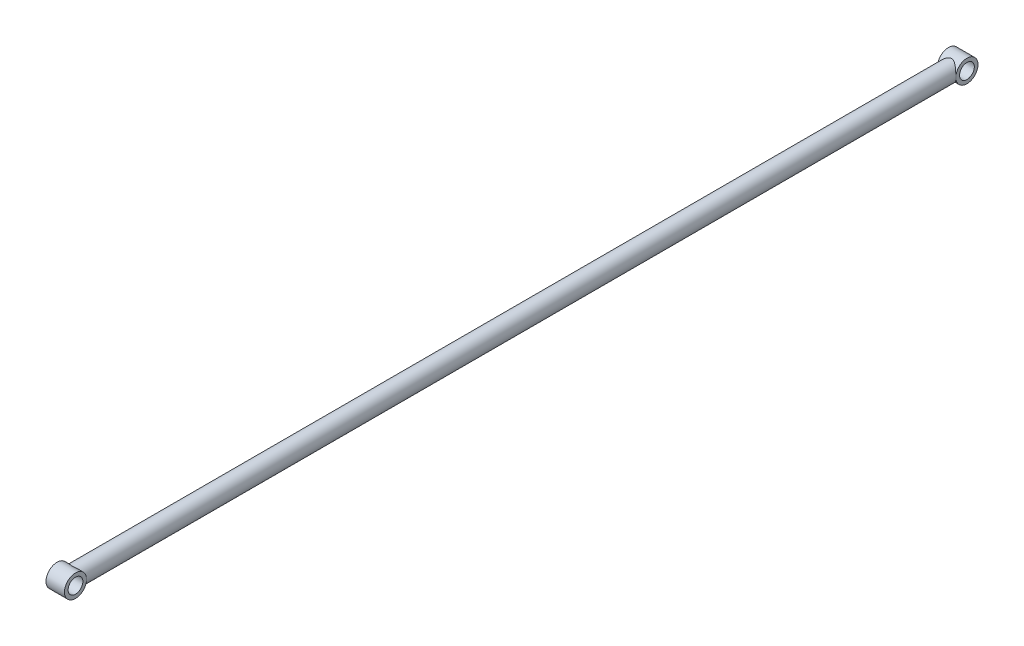
ISO-10303-21;
HEADER;
FILE_DESCRIPTION(('STEP AP214'),'2;1');
FILE_NAME('part.step','',(''),(''),'','','');
FILE_SCHEMA(('AUTOMOTIVE_DESIGN { 1 0 10303 214 1 1 1 1 }'));
ENDSEC;
DATA;
#1=APPLICATION_CONTEXT('core data for automotive mechanical design processes');
#2=APPLICATION_PROTOCOL_DEFINITION('international standard','automotive_design',2000,#1);
#3=PRODUCT_CONTEXT('',#1,'mechanical');
#4=PRODUCT('Part','Part','',(#3));
#5=PRODUCT_RELATED_PRODUCT_CATEGORY('part','',(#4));
#6=PRODUCT_DEFINITION_FORMATION('','',#4);
#7=PRODUCT_DEFINITION_CONTEXT('part definition',#1,'design');
#8=PRODUCT_DEFINITION('design','',#6,#7);
#9=PRODUCT_DEFINITION_SHAPE('','',#8);
#10=(LENGTH_UNIT() NAMED_UNIT(*) SI_UNIT(.MILLI.,.METRE.));
#11=(NAMED_UNIT(*) PLANE_ANGLE_UNIT() SI_UNIT($,.RADIAN.));
#12=(NAMED_UNIT(*) SI_UNIT($,.STERADIAN.) SOLID_ANGLE_UNIT());
#13=UNCERTAINTY_MEASURE_WITH_UNIT(LENGTH_MEASURE(1.E-05),#10,'distance_accuracy_value','');
#14=(GEOMETRIC_REPRESENTATION_CONTEXT(3) GLOBAL_UNCERTAINTY_ASSIGNED_CONTEXT((#13)) GLOBAL_UNIT_ASSIGNED_CONTEXT((#10,
#11,#12)) REPRESENTATION_CONTEXT('',''));
#15=CARTESIAN_POINT('',(0.,0.,0.));
#16=DIRECTION('',(0.,0.,1.));
#17=DIRECTION('',(1.,0.,0.));
#18=AXIS2_PLACEMENT_3D('',#15,#16,#17);
#19=CARTESIAN_POINT('',(0.,0.,483.));
#20=DIRECTION('',(0.,0.,-1.));
#21=DIRECTION('',(-1.,0.,0.));
#22=AXIS2_PLACEMENT_3D('',#19,#20,#21);
#23=CYLINDRICAL_SURFACE('',#22,5.);
#24=CARTESIAN_POINT('',(-5.,0.,477.));
#25=CARTESIAN_POINT('',(-5.0000064862677,-0.118803401095404,476.999993637204));
#26=CARTESIAN_POINT('',(-4.99576243276274,-0.237558182871216,477.003532436608));
#27=CARTESIAN_POINT('',(-4.97888342242901,-0.474087838067089,477.01758781878));
#28=CARTESIAN_POINT('',(-4.96624750352265,-0.591862597565706,477.028105201601));
#29=CARTESIAN_POINT('',(-4.93280067838579,-0.825474733693953,477.055890647865));
#30=CARTESIAN_POINT('',(-4.9119867768663,-0.941311384241484,477.073161184726));
#31=CARTESIAN_POINT('',(-4.86255145148515,-1.17018155731566,477.114066169517));
#32=CARTESIAN_POINT('',(-4.83392655878944,-1.28321381003106,477.137703444833));
#33=CARTESIAN_POINT('',(-4.73740362240781,-1.61550772291658,477.21712549774));
#34=CARTESIAN_POINT('',(-4.65860789353557,-1.82964493287685,477.281630481709));
#35=CARTESIAN_POINT('',(-4.47594785576943,-2.23973970904937,477.429432068903));
#36=CARTESIAN_POINT('',(-4.37207507698347,-2.43569110189251,477.512735020608));
#37=CARTESIAN_POINT('',(-4.17931765246547,-2.7487493551036,477.664796967453));
#38=CARTESIAN_POINT('',(-4.09605321766378,-2.87121824175387,477.729845481327));
#39=CARTESIAN_POINT('',(-3.92057491487889,-3.1065466737462,477.865043917853));
#40=CARTESIAN_POINT('',(-3.82836116355907,-3.21940634431807,477.935193773999));
#41=CARTESIAN_POINT('',(-3.63553308278673,-3.43568816068563,478.079330910766));
#42=CARTESIAN_POINT('',(-3.5348967895774,-3.53908406033979,478.153328021096));
#43=CARTESIAN_POINT('',(-3.32600704379386,-3.73607907111511,478.303506811469));
#44=CARTESIAN_POINT('',(-3.21775455132491,-3.82967941338623,478.379688215443));
#45=CARTESIAN_POINT('',(-2.99186847524307,-4.00872533168451,478.534090593809));
#46=CARTESIAN_POINT('',(-2.87409893732895,-4.09398918746849,478.612323305427));
#47=CARTESIAN_POINT('',(-2.63097870098589,-4.25431125048956,478.767590859531));
#48=CARTESIAN_POINT('',(-2.50562548412927,-4.32936604026977,478.844625293293));
#49=CARTESIAN_POINT('',(-2.24746866950536,-4.46882104937822,478.994988438694));
#50=CARTESIAN_POINT('',(-2.11468364253873,-4.53324636625597,479.068325587028));
#51=CARTESIAN_POINT('',(-1.84110422364282,-4.65107409789268,479.208445967709));
#52=CARTESIAN_POINT('',(-1.70031678782888,-4.70448590476213,479.275234758659));
#53=CARTESIAN_POINT('',(-1.39667622874435,-4.80387055780351,479.404163695034));
#54=CARTESIAN_POINT('',(-1.23299156369284,-4.84867766430581,479.465282103806));
#55=CARTESIAN_POINT('',(-0.896180811817653,-4.92202476595887,479.568128085754));
#56=CARTESIAN_POINT('',(-0.723078773763382,-4.95060424437364,479.609902678024));
#57=CARTESIAN_POINT('',(-0.457661896369253,-4.97982440219376,479.653115686237));
#58=CARTESIAN_POINT('',(-0.367618679010133,-4.98729261982802,479.6642863));
#59=CARTESIAN_POINT('',(-0.186635888055896,-4.99733565959028,479.679348465274));
#60=CARTESIAN_POINT('',(-0.0956963990750102,-4.99991093928053,479.683240697421));
#61=CARTESIAN_POINT('',(0.0861953552895639,-5.00008454722765,479.683502917529));
#62=CARTESIAN_POINT('',(0.177147620700363,-4.99768286475911,479.679872889279));
#63=CARTESIAN_POINT('',(0.358199787378176,-4.98797701095386,479.665309542838));
#64=CARTESIAN_POINT('',(0.448299583463676,-4.98067224244969,479.65437533504));
#65=CARTESIAN_POINT('',(0.634290345987583,-4.96055777117419,479.624616752253));
#66=CARTESIAN_POINT('',(0.730044329719831,-4.94734291419498,479.605214847078));
#67=CARTESIAN_POINT('',(0.919072038911291,-4.91574053984289,479.559612529394));
#68=CARTESIAN_POINT('',(1.01234395824124,-4.89734936269662,479.533407307809));
#69=CARTESIAN_POINT('',(1.28826795172837,-4.83487145070512,479.446256557005));
#70=CARTESIAN_POINT('',(1.46664526370671,-4.78352415648846,479.376845736021));
#71=CARTESIAN_POINT('',(1.77568076874682,-4.67632227850055,479.239951281895));
#72=CARTESIAN_POINT('',(1.90862269999424,-4.62355194613131,479.174992042876));
#73=CARTESIAN_POINT('',(2.16730339944141,-4.5080868127201,479.039561687936));
#74=CARTESIAN_POINT('',(2.2930378843367,-4.44538619181524,478.969087352102));
#75=CARTESIAN_POINT('',(2.53766285158925,-4.31043075762207,478.825081209764));
#76=CARTESIAN_POINT('',(2.65654383781034,-4.23816312441509,478.751545393107));
#77=CARTESIAN_POINT('',(2.88743564285212,-4.08435401417132,478.603472913388));
#78=CARTESIAN_POINT('',(2.99944783455598,-4.00281439970947,478.528936453981));
#79=CARTESIAN_POINT('',(3.22226109628938,-3.82600354374298,478.376579223159));
#80=CARTESIAN_POINT('',(3.33269201981398,-3.73023700414116,478.298790707347));
#81=CARTESIAN_POINT('',(3.54559939981495,-3.52848927170191,478.145535959127));
#82=CARTESIAN_POINT('',(3.64807467199073,-3.42250656330075,478.070070073477));
#83=CARTESIAN_POINT('',(3.84425294796657,-3.20056123189962,477.923183546337));
#84=CARTESIAN_POINT('',(3.93797365950219,-3.08461970676706,477.851754859816));
#85=CARTESIAN_POINT('',(4.11599426421243,-2.84274064052483,477.714338905395));
#86=CARTESIAN_POINT('',(4.20029381312791,-2.71680273442434,477.648351836361));
#87=CARTESIAN_POINT('',(4.39878554184224,-2.3882746321479,477.491466854075));
#88=CARTESIAN_POINT('',(4.50631929530232,-2.17932731194439,477.40501053214));
#89=CARTESIAN_POINT('',(4.64613821914317,-1.85137170360796,477.291596129459));
#90=CARTESIAN_POINT('',(4.689173122187,-1.73959798407532,477.256495593987));
#91=CARTESIAN_POINT('',(4.76751793421721,-1.51170856686371,477.192357028335));
#92=CARTESIAN_POINT('',(4.8028317106046,-1.39559507719854,477.163315963388));
#93=CARTESIAN_POINT('',(4.8654345331928,-1.15874024023418,477.111694818951));
#94=CARTESIAN_POINT('',(4.89265476556206,-1.0379685511683,477.089170185509));
#95=CARTESIAN_POINT('',(4.93816722227974,-0.793680719841815,477.0514427748));
#96=CARTESIAN_POINT('',(4.95646386645161,-0.670165967971585,477.036236372888));
#97=CARTESIAN_POINT('',(4.98377697031547,-0.421443909131152,477.013517273965));
#98=CARTESIAN_POINT('',(4.99279601788869,-0.296237084023795,477.006002431483));
#99=CARTESIAN_POINT('',(5.00137053830483,-0.0452813606586437,476.998858338269));
#100=CARTESIAN_POINT('',(5.00092704086014,0.0804674771284984,476.999228229523));
#101=CARTESIAN_POINT('',(4.99121319090849,0.316217699578095,477.007320807918));
#102=CARTESIAN_POINT('',(4.9830095886813,0.426296149457927,477.014154882391));
#103=CARTESIAN_POINT('',(4.95942180024421,0.64517857144736,477.033776596911));
#104=CARTESIAN_POINT('',(4.94403538382094,0.753982136950752,477.046566086069));
#105=CARTESIAN_POINT('',(4.90632392627912,0.969508932578446,477.077846411027));
#106=CARTESIAN_POINT('',(4.88400108118505,1.07623280976907,477.096335442378));
#107=CARTESIAN_POINT('',(4.8327411453964,1.28701083316523,477.138670741227));
#108=CARTESIAN_POINT('',(4.80380153552002,1.39106394571253,477.162519049088));
#109=CARTESIAN_POINT('',(4.70677908129294,1.70100357204874,477.242190020335));
#110=CARTESIAN_POINT('',(4.62897463511249,1.90197317990282,477.305734510938));
#111=CARTESIAN_POINT('',(4.45119251532416,2.28736622034071,477.449291701797));
#112=CARTESIAN_POINT('',(4.35120664535604,2.47178350112449,477.529310488757));
#113=CARTESIAN_POINT('',(4.16241303362752,2.77431022087595,477.678035970102));
#114=CARTESIAN_POINT('',(4.07807881363132,2.89671891082132,477.74381246034));
#115=CARTESIAN_POINT('',(3.90043631108387,3.1318212445681,477.880412696568));
#116=CARTESIAN_POINT('',(3.80712768883622,3.24451452031815,477.951236633586));
#117=CARTESIAN_POINT('',(3.61204642318564,3.46039828484852,478.096670900892));
#118=CARTESIAN_POINT('',(3.51024916115602,3.56355916557869,478.171291981155));
#119=CARTESIAN_POINT('',(3.29899388009138,3.75997885952884,478.322615719837));
#120=CARTESIAN_POINT('',(3.18953694443014,3.85323906840856,478.399318082945));
#121=CARTESIAN_POINT('',(2.96121350414865,4.03144708201697,478.554592788302));
#122=CARTESIAN_POINT('',(2.84221365304639,4.11621624228707,478.633174029159));
#123=CARTESIAN_POINT('',(2.59654816531034,4.27543853436333,478.788939860809));
#124=CARTESIAN_POINT('',(2.46987979366061,4.34988795406836,478.866123940397));
#125=CARTESIAN_POINT('',(2.20902653418008,4.48797579821684,479.016477189005));
#126=CARTESIAN_POINT('',(2.0748627531341,4.55164272839419,479.089656586787));
#127=CARTESIAN_POINT('',(1.79841659242417,4.66777738062605,479.22904841427));
#128=CARTESIAN_POINT('',(1.65614180525592,4.72025536508454,479.295267199669));
#129=CARTESIAN_POINT('',(1.35146946258264,4.81674752553359,479.421491086304));
#130=CARTESIAN_POINT('',(1.18836978046208,4.85976816309613,479.480594639897));
#131=CARTESIAN_POINT('',(0.853057506761427,4.9296432417836,479.579129868936));
#132=CARTESIAN_POINT('',(0.680868858019852,4.95653805629941,479.618610630155));
#133=CARTESIAN_POINT('',(0.417267118823255,4.98335884043905,479.658388143927));
#134=CARTESIAN_POINT('',(0.327939885729207,4.99004397434121,479.668407002933));
#135=CARTESIAN_POINT('',(0.148522532583795,4.9985987546237,479.681253423056));
#136=CARTESIAN_POINT('',(0.0584324772191264,5.00046880529626,479.68408158793));
#137=CARTESIAN_POINT('',(-0.121644228189545,4.99933140644563,479.682367649082));
#138=CARTESIAN_POINT('',(-0.211630875727444,4.9963238411074,479.677825370354));
#139=CARTESIAN_POINT('',(-0.390705731691063,4.98551920595952,479.661633404506));
#140=CARTESIAN_POINT('',(-0.479793444537757,4.9777196268474,479.649979993715));
#141=CARTESIAN_POINT('',(-0.665670000297338,4.95646386284236,479.618601030407));
#142=CARTESIAN_POINT('',(-0.762277582328066,4.94249693749089,479.598152480986));
#143=CARTESIAN_POINT('',(-0.952897655384701,4.90931375512972,479.550437000639));
#144=CARTESIAN_POINT('',(-1.04690820177175,4.89009367595841,479.523165106317));
#145=CARTESIAN_POINT('',(-1.32490519247817,4.82502893529804,479.432849622302));
#146=CARTESIAN_POINT('',(-1.50447425917324,4.77182601328654,479.361379650537));
#147=CARTESIAN_POINT('',(-1.81560530153243,4.66101333620408,479.220942915864));
#148=CARTESIAN_POINT('',(-1.94948557461575,4.60651894445027,479.154442116725));
#149=CARTESIAN_POINT('',(-2.20989471783698,4.48741065580192,479.016097847012));
#150=CARTESIAN_POINT('',(-2.33641925480263,4.42279087534705,478.944251283));
#151=CARTESIAN_POINT('',(-2.5824750393766,4.28378589016378,478.797690769041));
#152=CARTESIAN_POINT('',(-2.70199665984685,4.20938767793853,478.722973095249));
#153=CARTESIAN_POINT('',(-2.93399936330076,4.05109347216135,478.572749153453));
#154=CARTESIAN_POINT('',(-3.04648185894299,3.96719939385672,478.497243047248));
#155=CARTESIAN_POINT('',(-3.26970299172266,3.78559728592243,478.343380537841));
#156=CARTESIAN_POINT('',(-3.3800842070449,3.68741297206322,478.265066438866));
#157=CARTESIAN_POINT('',(-3.59266286414712,3.48062708656653,478.111046523001));
#158=CARTESIAN_POINT('',(-3.69485901563621,3.3720238784052,478.035341118412));
#159=CARTESIAN_POINT('',(-3.89018127821474,3.14465963115777,477.888308540529));
#160=CARTESIAN_POINT('',(-3.98332637820879,3.02592088507445,477.816972322432));
#161=CARTESIAN_POINT('',(-4.15984718243097,2.77827797167377,477.680110195278));
#162=CARTESIAN_POINT('',(-4.24322187964889,2.64937275881158,477.614584885306));
#163=CARTESIAN_POINT('',(-4.43658392581503,2.31715775505719,477.461199242977));
#164=CARTESIAN_POINT('',(-4.54010823809425,2.1078590133518,477.377736073905));
#165=CARTESIAN_POINT('',(-4.67390583373148,1.78004652854666,477.268967142579));
#166=CARTESIAN_POINT('',(-4.71491832045568,1.66848545194781,477.235452843433));
#167=CARTESIAN_POINT('',(-4.78927419077684,1.44122911865454,477.174479197701));
#168=CARTESIAN_POINT('',(-4.82261863938538,1.3255344386571,477.147019010283));
#169=CARTESIAN_POINT('',(-4.90034346391489,1.01333234603933,477.082855108749));
#170=CARTESIAN_POINT('',(-4.937546782437,0.813745597053018,477.05195986098));
#171=CARTESIAN_POINT('',(-4.98736819813601,0.409390797411289,477.010538835449));
#172=CARTESIAN_POINT('',(-4.99998882825426,0.204623282772224,477.000010959083));
#173=CARTESIAN_POINT('',(-5.,0.,477.));
#174=B_SPLINE_CURVE_WITH_KNOTS('',3,(#24,#25,#26,#27,#28,#29,#30,#31,#32,#33,#34,#35,#36,#37,
#38,#39,#40,#41,#42,#43,#44,#45,#46,#47,#48,#49,#50,#51,#52,#53,#54,#55,#56,#57,#58,#59,#60,#61,
#62,#63,#64,#65,#66,#67,#68,#69,#70,#71,#72,#73,#74,#75,#76,#77,#78,#79,#80,#81,#82,#83,#84,#85,
#86,#87,#88,#89,#90,#91,#92,#93,#94,#95,#96,#97,#98,#99,#100,#101,#102,#103,#104,#105,#106,#107,
#108,#109,#110,#111,#112,#113,#114,#115,#116,#117,#118,#119,#120,#121,#122,#123,#124,#125,#126,
#127,#128,#129,#130,#131,#132,#133,#134,#135,#136,#137,#138,#139,#140,#141,#142,#143,#144,#145,
#146,#147,#148,#149,#150,#151,#152,#153,#154,#155,#156,#157,#158,#159,#160,#161,#162,#163,#164,
#165,#166,#167,#168,#169,#170,#171,#172,#173),.UNSPECIFIED.,.T.,.F.,(4,2,2,2,2,2,2,2,2,2,2,2,2,
2,2,2,2,2,2,2,2,2,2,2,2,2,2,2,2,2,2,2,2,2,2,2,2,2,2,2,2,2,2,2,2,2,2,2,2,2,2,2,2,2,2,2,2,2,2,2,2,
2,2,2,2,2,2,2,2,2,2,2,2,2,4),(0.,0.356198531128416,0.712437905356867,1.06880787854775,
1.42533637270189,2.13333209783901,2.84156728725028,3.32622201622347,3.81087042808179,
4.29682459639562,4.78271761425378,5.27755036039969,5.77254834493278,6.26636031071484,
6.75974940543418,7.29936255278486,7.83765708456697,8.11040822806109,8.383133864024,
8.6558600877151,8.92861953390798,9.22392701856227,9.51944381892732,10.1116379066242,
10.582376912049,11.0533928323055,11.5250464324408,11.996605452641,12.4928422896339,
12.9891528567515,13.4844367603641,13.9797387562553,14.7274446962694,15.1015034988402,
15.4753745093338,15.8523389140403,16.2291164194434,16.6057887984767,16.9824201883013,
17.3138076935886,17.6452981608745,17.9766837873555,18.3081957920454,18.9794342536001,
19.6509211619366,20.1379627282137,20.6250227371038,21.1135480143904,21.6020043344425,
22.0992028034936,22.5965796576368,23.0926203414624,23.5882040850609,24.1228614856739,
24.6561746412002,24.9262177314023,25.1962381470461,25.4662649741993,25.7364333195519,
26.0351569724181,26.3340985560116,26.9331443359534,27.4099325615986,27.886998869087,
28.3647063284085,28.8423176087135,29.3434029116177,29.8445670506113,30.3446559675375,
30.8447963820895,31.5852621624672,31.9553671316837,32.3254206660413,32.9389891607905,
33.5524944315665),.UNSPECIFIED.);
#175=CARTESIAN_POINT('',(-5.,0.,477.));
#176=VERTEX_POINT('',#175);
#177=CARTESIAN_POINT('',(5.00000000000002,0.,477.));
#178=VERTEX_POINT('',#177);
#179=EDGE_CURVE('E75',#176,#178,#174,.T.);
#180=ORIENTED_EDGE('',*,*,#179,.F.);
#181=EDGE_CURVE('E61',#178,#176,#174,.T.);
#182=ORIENTED_EDGE('',*,*,#181,.F.);
#183=EDGE_LOOP('',(#180,#182));
#184=FACE_BOUND('',#183,.T.);
#185=CARTESIAN_POINT('',(5.,0.,6.));
#186=CARTESIAN_POINT('',(5.00002798627288,-0.119348935079419,6.00002919850301));
#187=CARTESIAN_POINT('',(4.99572803553543,-0.23867958036178,5.99644020652463));
#188=CARTESIAN_POINT('',(4.97868412788821,-0.476234476230305,5.98224494804962));
#189=CARTESIAN_POINT('',(4.96594611312676,-0.594459446069387,5.97164361970086));
#190=CARTESIAN_POINT('',(4.93236700382239,-0.828002477996366,5.94374988935124));
#191=CARTESIAN_POINT('',(4.91158897146557,-0.943335902346165,5.9265095655111));
#192=CARTESIAN_POINT('',(4.86229105276058,-1.17120170011539,5.8857184515863));
#193=CARTESIAN_POINT('',(4.83377018032473,-1.28373371476774,5.86216685773619));
#194=CARTESIAN_POINT('',(4.76951835736753,-1.50496658686726,5.80930051949784));
#195=CARTESIAN_POINT('',(4.73380779812543,-1.61367728038003,5.78000208014341));
#196=CARTESIAN_POINT('',(4.65562143123109,-1.82705211318845,5.71614428529929));
#197=CARTESIAN_POINT('',(4.61314316805229,-1.93171476653797,5.68158302050031));
#198=CARTESIAN_POINT('',(4.47616272504167,-2.23926573906388,5.57073812162035));
#199=CARTESIAN_POINT('',(4.3721770693891,-2.43550744867541,5.48734511252619));
#200=CARTESIAN_POINT('',(4.17930372356553,-2.7487842906501,5.33519226752433));
#201=CARTESIAN_POINT('',(4.09603750264319,-2.87124496412886,5.2701422858056));
#202=CARTESIAN_POINT('',(3.92054441805434,-3.10658192431559,5.13493271106889));
#203=CARTESIAN_POINT('',(3.82831737859482,-3.2194580229123,5.06477301781555));
#204=CARTESIAN_POINT('',(3.63548337755196,-3.43574133365567,4.92063241630692));
#205=CARTESIAN_POINT('',(3.53485619448337,-3.53912436048791,4.84664246009394));
#206=CARTESIAN_POINT('',(3.32598578779926,-3.7360970997034,4.69647824059821));
#207=CARTESIAN_POINT('',(3.21774353082589,-3.82968805133515,4.62030425527637));
#208=CARTESIAN_POINT('',(2.99186761360954,-4.00872611376803,4.46590881347895));
#209=CARTESIAN_POINT('',(2.87409722305524,-4.0939904560112,4.3876755543847));
#210=CARTESIAN_POINT('',(2.6309750881559,-4.25431349476038,4.23240687859203));
#211=CARTESIAN_POINT('',(2.50562082230674,-4.32936876969041,4.15537187111191));
#212=CARTESIAN_POINT('',(2.24746373773334,-4.46882350281307,4.00500880900492));
#213=CARTESIAN_POINT('',(2.114679606144,-4.53324821588881,3.93167226471335));
#214=CARTESIAN_POINT('',(1.84110210714595,-4.65107489837774,3.7915530290794));
#215=CARTESIAN_POINT('',(1.70031569672374,-4.70448626106774,3.72476477842125));
#216=CARTESIAN_POINT('',(1.39667699983213,-4.80387030632006,3.59583663196801));
#217=CARTESIAN_POINT('',(1.23299315747397,-4.84867722860129,3.53471849082027));
#218=CARTESIAN_POINT('',(0.896182495864177,-4.92202448714337,3.43187232185616));
#219=CARTESIAN_POINT('',(0.723079629981996,-4.95060414994846,3.39009746162937));
#220=CARTESIAN_POINT('',(0.457661938224444,-4.97982439766832,3.34688432045088));
#221=CARTESIAN_POINT('',(0.367618763795172,-4.98729261281735,3.33571371048368));
#222=CARTESIAN_POINT('',(0.186636059098122,-4.99733565239978,3.32065154554476));
#223=CARTESIAN_POINT('',(0.095696613445123,-4.99991093439811,3.316759309933));
#224=CARTESIAN_POINT('',(-0.0861951407917185,-5.00008455170297,3.31649707573075));
#225=CARTESIAN_POINT('',(-0.177147449414514,-4.99768287160056,3.32012710042958));
#226=CARTESIAN_POINT('',(-0.358199702166334,-4.98797701786367,3.33469044681948));
#227=CARTESIAN_POINT('',(-0.448299541111552,-4.98067224704856,3.34562465813616));
#228=CARTESIAN_POINT('',(-0.634291003932044,-4.9605576999989,3.3753833530699));
#229=CARTESIAN_POINT('',(-0.730045633205449,-4.94734273423708,3.39478541722633));
#230=CARTESIAN_POINT('',(-0.919074596107933,-4.91574007429052,3.44038813776632));
#231=CARTESIAN_POINT('',(-1.0123471235597,-4.89734872024239,3.46659360333995));
#232=CARTESIAN_POINT('',(-1.28827037830915,-4.83487075242421,3.55374438737304));
#233=CARTESIAN_POINT('',(-1.46664643390008,-4.783523750858,3.62315478197574));
#234=CARTESIAN_POINT('',(-1.77567908944062,-4.67632286079959,3.76004797450957));
#235=CARTESIAN_POINT('',(-1.90861943875745,-4.62355324007214,3.82500636461011));
#236=CARTESIAN_POINT('',(-2.1672971701239,-4.50808975490199,3.96043493597843));
#237=CARTESIAN_POINT('',(-2.29303026764359,-4.44539006893123,4.03090833809998));
#238=CARTESIAN_POINT('',(-2.53765563195538,-4.31043506598059,4.1749143659975));
#239=CARTESIAN_POINT('',(-2.6565382300731,-4.23816669614868,4.24845107486114));
#240=CARTESIAN_POINT('',(-2.88743300391471,-4.08435593589021,4.39652533009788));
#241=CARTESIAN_POINT('',(-2.99944655755873,-4.00281541487259,4.47106267206462));
#242=CARTESIAN_POINT('',(-3.22225027568276,-3.82601212839693,4.62341337862811));
#243=CARTESIAN_POINT('',(-3.33267109721392,-3.73025514063295,4.70119455751783));
#244=CARTESIAN_POINT('',(-3.54556008678871,-3.52852821337353,4.85443541775559));
#245=CARTESIAN_POINT('',(-3.64802705005762,-3.42255673211236,4.92989474637107));
#246=CARTESIAN_POINT('',(-3.84421060857415,-3.2006128271596,5.07678427846323));
#247=CARTESIAN_POINT('',(-3.93794315555609,-3.08465940978153,5.14822172873355));
#248=CARTESIAN_POINT('',(-4.11598177032474,-2.84275936137359,5.28565131588156));
#249=CARTESIAN_POINT('',(-4.20028786473935,-2.71681275857424,5.35164346814102));
#250=CARTESIAN_POINT('',(-4.39889001810325,-2.38810144095985,5.50861571334714));
#251=CARTESIAN_POINT('',(-4.50650789937269,-2.17895977321482,5.59514105315609));
#252=CARTESIAN_POINT('',(-4.64632915436093,-1.85088623475908,5.70855943809661));
#253=CARTESIAN_POINT('',(-4.68931579975437,-1.73920687354843,5.74362100254321));
#254=CARTESIAN_POINT('',(-4.76757931871188,-1.51150608578613,5.80769343721714));
#255=CARTESIAN_POINT('',(-4.8028598770863,-1.39548676568957,5.83670719901046));
#256=CARTESIAN_POINT('',(-4.86104289099879,-1.17535732699399,5.88468396792441));
#257=CARTESIAN_POINT('',(-4.88496398649261,-1.07169341842585,5.90446771651074));
#258=CARTESIAN_POINT('',(-4.92625539477401,-0.862207885533472,5.93867484563281));
#259=CARTESIAN_POINT('',(-4.94362692805165,-0.756386667094952,5.95309922486268));
#260=CARTESIAN_POINT('',(-4.97164997323593,-0.542568390622355,5.97639011806746));
#261=CARTESIAN_POINT('',(-4.98225886411516,-0.434561874332823,5.9852213796444));
#262=CARTESIAN_POINT('',(-4.99644567156344,-0.217707897793812,5.99703818296618));
#263=CARTESIAN_POINT('',(-5.00001943921961,-0.108859979293944,6.00002027520211));
#264=CARTESIAN_POINT('',(-5.,0.,6.));
#265=B_SPLINE_CURVE_WITH_KNOTS('',3,(#185,#186,#187,#188,#189,#190,#191,#192,#193,#194,#195,
#196,#197,#198,#199,#200,#201,#202,#203,#204,#205,#206,#207,#208,#209,#210,#211,#212,#213,#214,
#215,#216,#217,#218,#219,#220,#221,#222,#223,#224,#225,#226,#227,#228,#229,#230,#231,#232,#233,
#234,#235,#236,#237,#238,#239,#240,#241,#242,#243,#244,#245,#246,#247,#248,#249,#250,#251,#252,
#253,#254,#255,#256,#257,#258,#259,#260,#261,#262,#263,#264),.UNSPECIFIED.,.F.,.F.,(4,2,2,2,2,2,
2,2,2,2,2,2,2,2,2,2,2,2,2,2,2,2,2,2,2,2,2,2,2,2,2,2,2,2,2,2,2,2,2,4),(0.,0.357886576578299,
0.715521394269878,1.07040616284639,1.42533614891328,1.77927332038449,2.13333920459453,
2.84213783886469,3.32683244474596,3.81153656126864,4.29744314238673,4.78328815440653,
5.27812448023868,5.77312624430843,6.26693455915681,6.76031994717008,7.29993047702809,
7.83822762424364,8.1109786393578,8.38370414677767,8.65643049857137,8.92919007358413,
9.2244995672027,9.52001838035353,10.112208453625,10.5829416913736,11.0539519263477,
11.52561142687,11.997176001593,12.4933658472267,12.9896307049052,13.4849706986806,
13.9803092931816,14.7286685065876,15.1023956024283,15.4759436005044,15.8002491052014,
16.124494146696,16.4507630235861,16.7772242576031),.UNSPECIFIED.);
#266=CARTESIAN_POINT('',(5.,0.,6.));
#267=VERTEX_POINT('',#266);
#268=CARTESIAN_POINT('',(-5.,0.,6.));
#269=VERTEX_POINT('',#268);
#270=EDGE_CURVE('E11',#267,#269,#265,.T.);
#271=ORIENTED_EDGE('',*,*,#270,.F.);
#272=CARTESIAN_POINT('',(-5.,0.,6.));
#273=CARTESIAN_POINT('',(-5.00002798627288,0.119348935079419,6.00002919850301));
#274=CARTESIAN_POINT('',(-4.99572803553543,0.23867958036178,5.99644020652463));
#275=CARTESIAN_POINT('',(-4.97868412788821,0.476234476230305,5.98224494804962));
#276=CARTESIAN_POINT('',(-4.96594611312676,0.594459446069387,5.97164361970086));
#277=CARTESIAN_POINT('',(-4.93236700382239,0.828002477996366,5.94374988935124));
#278=CARTESIAN_POINT('',(-4.91158897146557,0.943335902346166,5.9265095655111));
#279=CARTESIAN_POINT('',(-4.86229105276058,1.17120170011539,5.8857184515863));
#280=CARTESIAN_POINT('',(-4.83377018032473,1.28373371476774,5.86216685773619));
#281=CARTESIAN_POINT('',(-4.76951835736753,1.50496658686726,5.80930051949784));
#282=CARTESIAN_POINT('',(-4.73380779812543,1.61367728038003,5.78000208014341));
#283=CARTESIAN_POINT('',(-4.65562143123109,1.82705211318845,5.71614428529929));
#284=CARTESIAN_POINT('',(-4.61314316805229,1.93171476653797,5.68158302050031));
#285=CARTESIAN_POINT('',(-4.47616272504167,2.23926573906388,5.57073812162035));
#286=CARTESIAN_POINT('',(-4.3721770693891,2.43550744867541,5.48734511252619));
#287=CARTESIAN_POINT('',(-4.17930372356553,2.7487842906501,5.33519226752433));
#288=CARTESIAN_POINT('',(-4.09603750264319,2.87124496412886,5.2701422858056));
#289=CARTESIAN_POINT('',(-3.92054441805434,3.10658192431559,5.13493271106889));
#290=CARTESIAN_POINT('',(-3.82831737859482,3.2194580229123,5.06477301781555));
#291=CARTESIAN_POINT('',(-3.63548337755196,3.43574133365567,4.92063241630691));
#292=CARTESIAN_POINT('',(-3.53485619448337,3.53912436048791,4.84664246009394));
#293=CARTESIAN_POINT('',(-3.32598578779926,3.7360970997034,4.69647824059821));
#294=CARTESIAN_POINT('',(-3.21774353082589,3.82968805133515,4.62030425527637));
#295=CARTESIAN_POINT('',(-2.99186761360954,4.00872611376803,4.46590881347895));
#296=CARTESIAN_POINT('',(-2.87409722305524,4.0939904560112,4.3876755543847));
#297=CARTESIAN_POINT('',(-2.6309750881559,4.25431349476038,4.23240687859203));
#298=CARTESIAN_POINT('',(-2.50562082230674,4.32936876969041,4.15537187111191));
#299=CARTESIAN_POINT('',(-2.24746373773334,4.46882350281307,4.00500880900492));
#300=CARTESIAN_POINT('',(-2.114679606144,4.53324821588881,3.93167226471335));
#301=CARTESIAN_POINT('',(-1.84110210714595,4.65107489837774,3.7915530290794));
#302=CARTESIAN_POINT('',(-1.70031569672374,4.70448626106774,3.72476477842125));
#303=CARTESIAN_POINT('',(-1.39667699983213,4.80387030632006,3.59583663196801));
#304=CARTESIAN_POINT('',(-1.23299315747397,4.84867722860129,3.53471849082027));
#305=CARTESIAN_POINT('',(-0.896182495864177,4.92202448714337,3.43187232185616));
#306=CARTESIAN_POINT('',(-0.723079629981996,4.95060414994845,3.39009746162936));
#307=CARTESIAN_POINT('',(-0.457661938224445,4.97982439766832,3.34688432045088));
#308=CARTESIAN_POINT('',(-0.367618763795173,4.98729261281735,3.33571371048368));
#309=CARTESIAN_POINT('',(-0.186636059098122,4.99733565239978,3.32065154554476));
#310=CARTESIAN_POINT('',(-0.0956966134451239,4.99991093439811,3.316759309933));
#311=CARTESIAN_POINT('',(0.0861951407917178,5.00008455170297,3.31649707573075));
#312=CARTESIAN_POINT('',(0.177147449414514,4.99768287160056,3.32012710042958));
#313=CARTESIAN_POINT('',(0.358199702166334,4.98797701786367,3.33469044681948));
#314=CARTESIAN_POINT('',(0.448299541111552,4.98067224704856,3.34562465813616));
#315=CARTESIAN_POINT('',(0.634291003932044,4.9605576999989,3.3753833530699));
#316=CARTESIAN_POINT('',(0.730045633205449,4.94734273423708,3.39478541722633));
#317=CARTESIAN_POINT('',(0.919074596107933,4.91574007429052,3.44038813776632));
#318=CARTESIAN_POINT('',(1.0123471235597,4.89734872024239,3.46659360333995));
#319=CARTESIAN_POINT('',(1.28827037830915,4.83487075242421,3.55374438737304));
#320=CARTESIAN_POINT('',(1.46664643390008,4.783523750858,3.62315478197574));
#321=CARTESIAN_POINT('',(1.77567908944062,4.67632286079959,3.76004797450956));
#322=CARTESIAN_POINT('',(1.90861943875745,4.62355324007214,3.82500636461011));
#323=CARTESIAN_POINT('',(2.1672971701239,4.50808975490199,3.96043493597843));
#324=CARTESIAN_POINT('',(2.29303026764359,4.44539006893123,4.03090833809998));
#325=CARTESIAN_POINT('',(2.53765563195538,4.31043506598059,4.1749143659975));
#326=CARTESIAN_POINT('',(2.6565382300731,4.23816669614868,4.24845107486114));
#327=CARTESIAN_POINT('',(2.88743300391471,4.08435593589021,4.39652533009788));
#328=CARTESIAN_POINT('',(2.99944655755873,4.00281541487259,4.47106267206462));
#329=CARTESIAN_POINT('',(3.22225027568276,3.82601212839693,4.62341337862811));
#330=CARTESIAN_POINT('',(3.33267109721392,3.73025514063295,4.70119455751783));
#331=CARTESIAN_POINT('',(3.54556008678871,3.52852821337353,4.85443541775559));
#332=CARTESIAN_POINT('',(3.64802705005762,3.42255673211236,4.92989474637106));
#333=CARTESIAN_POINT('',(3.84421060857415,3.2006128271596,5.07678427846323));
#334=CARTESIAN_POINT('',(3.93794315555608,3.08465940978153,5.14822172873355));
#335=CARTESIAN_POINT('',(4.11598177032474,2.84275936137359,5.28565131588156));
#336=CARTESIAN_POINT('',(4.20028786473935,2.71681275857424,5.35164346814102));
#337=CARTESIAN_POINT('',(4.39889001810325,2.38810144095985,5.50861571334714));
#338=CARTESIAN_POINT('',(4.50650789937269,2.17895977321482,5.59514105315609));
#339=CARTESIAN_POINT('',(4.64632915436093,1.85088623475909,5.7085594380966));
#340=CARTESIAN_POINT('',(4.68931579975437,1.73920687354843,5.74362100254321));
#341=CARTESIAN_POINT('',(4.76757931871188,1.51150608578613,5.80769343721714));
#342=CARTESIAN_POINT('',(4.8028598770863,1.39548676568957,5.83670719901046));
#343=CARTESIAN_POINT('',(4.86104289099879,1.17535732699399,5.88468396792441));
#344=CARTESIAN_POINT('',(4.88496398649261,1.07169341842586,5.90446771651074));
#345=CARTESIAN_POINT('',(4.92625539477401,0.862207885533474,5.93867484563281));
#346=CARTESIAN_POINT('',(4.94362692805165,0.756386667094954,5.95309922486268));
#347=CARTESIAN_POINT('',(4.97164997323593,0.542568390622357,5.97639011806746));
#348=CARTESIAN_POINT('',(4.98225886411516,0.434561874332825,5.9852213796444));
#349=CARTESIAN_POINT('',(4.99644567156344,0.217707897793812,5.99703818296618));
#350=CARTESIAN_POINT('',(5.00001943921961,0.108859979293944,6.0000202752021));
#351=CARTESIAN_POINT('',(5.,0.,6.));
#352=B_SPLINE_CURVE_WITH_KNOTS('',3,(#272,#273,#274,#275,#276,#277,#278,#279,#280,#281,#282,
#283,#284,#285,#286,#287,#288,#289,#290,#291,#292,#293,#294,#295,#296,#297,#298,#299,#300,#301,
#302,#303,#304,#305,#306,#307,#308,#309,#310,#311,#312,#313,#314,#315,#316,#317,#318,#319,#320,
#321,#322,#323,#324,#325,#326,#327,#328,#329,#330,#331,#332,#333,#334,#335,#336,#337,#338,#339,
#340,#341,#342,#343,#344,#345,#346,#347,#348,#349,#350,#351),.UNSPECIFIED.,.F.,.F.,(4,2,2,2,2,2,
2,2,2,2,2,2,2,2,2,2,2,2,2,2,2,2,2,2,2,2,2,2,2,2,2,2,2,2,2,2,2,2,2,4),(0.,0.357886576578299,
0.715521394269878,1.07040616284639,1.42533614891328,1.77927332038448,2.13333920459453,
2.84213783886469,3.32683244474596,3.81153656126864,4.29744314238673,4.78328815440653,
5.27812448023868,5.77312624430843,6.26693455915681,6.76031994717008,7.29993047702809,
7.83822762424363,8.11097863935779,8.38370414677767,8.65643049857137,8.92919007358413,
9.2244995672027,9.52001838035353,10.112208453625,10.5829416913736,11.0539519263477,
11.52561142687,11.997176001593,12.4933658472267,12.9896307049052,13.4849706986806,
13.9803092931816,14.7286685065876,15.1023956024283,15.4759436005045,15.8002491052014,
16.124494146696,16.4507630235861,16.7772242576031),.UNSPECIFIED.);
#353=EDGE_CURVE('E49',#269,#267,#352,.T.);
#354=ORIENTED_EDGE('',*,*,#353,.F.);
#355=EDGE_LOOP('',(#271,#354));
#356=FACE_BOUND('',#355,.T.);
#357=ADVANCED_FACE('F39',(#184,#356),#23,.T.);
#358=CARTESIAN_POINT('',(5.,0.,483.));
#359=DIRECTION('',(-1.,0.,0.));
#360=DIRECTION('',(0.,0.,1.));
#361=AXIS2_PLACEMENT_3D('',#358,#359,#360);
#362=CYLINDRICAL_SURFACE('',#361,5.99999999999999);
#363=CARTESIAN_POINT('',(-5.,0.,483.));
#364=DIRECTION('',(1.,0.,0.));
#365=DIRECTION('',(0.,0.,-1.));
#366=AXIS2_PLACEMENT_3D('',#363,#364,#365);
#367=CIRCLE('',#366,5.99999999999999);
#368=EDGE_CURVE('E80',#176,#176,#367,.T.);
#369=ORIENTED_EDGE('',*,*,#368,.T.);
#370=ORIENTED_EDGE('',*,*,#179,.T.);
#371=CARTESIAN_POINT('',(5.,0.,483.));
#372=DIRECTION('',(1.,0.,0.));
#373=DIRECTION('',(0.,0.,-1.));
#374=AXIS2_PLACEMENT_3D('',#371,#372,#373);
#375=CIRCLE('',#374,5.99999999999999);
#376=EDGE_CURVE('E85',#178,#178,#375,.T.);
#377=ORIENTED_EDGE('',*,*,#376,.F.);
#378=ORIENTED_EDGE('',*,*,#181,.T.);
#379=EDGE_LOOP('',(#369,#370,#377,#378));
#380=FACE_BOUND('',#379,.T.);
#381=ADVANCED_FACE('F104',(#380),#362,.T.);
#382=CARTESIAN_POINT('',(5.,0.,483.));
#383=DIRECTION('',(1.,0.,0.));
#384=DIRECTION('',(0.,0.,-1.));
#385=AXIS2_PLACEMENT_3D('',#382,#383,#384);
#386=PLANE('',#385);
#387=CARTESIAN_POINT('',(5.,0.,483.));
#388=DIRECTION('',(1.,0.,0.));
#389=DIRECTION('',(0.,0.,-1.));
#390=AXIS2_PLACEMENT_3D('',#387,#388,#389);
#391=CIRCLE('',#390,3.99999999999999);
#392=CARTESIAN_POINT('',(5.,0.,479.));
#393=VERTEX_POINT('',#392);
#394=EDGE_CURVE('E129',#393,#393,#391,.T.);
#395=ORIENTED_EDGE('',*,*,#394,.F.);
#396=EDGE_LOOP('',(#395));
#397=FACE_BOUND('',#396,.T.);
#398=ORIENTED_EDGE('',*,*,#376,.T.);
#399=EDGE_LOOP('',(#398));
#400=FACE_BOUND('',#399,.T.);
#401=ADVANCED_FACE('F108',(#397,#400),#386,.T.);
#402=CARTESIAN_POINT('',(-5.,0.,483.));
#403=DIRECTION('',(1.,0.,0.));
#404=DIRECTION('',(0.,0.,-1.));
#405=AXIS2_PLACEMENT_3D('',#402,#403,#404);
#406=PLANE('',#405);
#407=CARTESIAN_POINT('',(-5.,0.,483.));
#408=DIRECTION('',(1.,0.,0.));
#409=DIRECTION('',(0.,0.,-1.));
#410=AXIS2_PLACEMENT_3D('',#407,#408,#409);
#411=CIRCLE('',#410,3.99999999999999);
#412=CARTESIAN_POINT('',(-5.,0.,479.));
#413=VERTEX_POINT('',#412);
#414=EDGE_CURVE('E43',#413,#413,#411,.T.);
#415=ORIENTED_EDGE('',*,*,#414,.T.);
#416=EDGE_LOOP('',(#415));
#417=FACE_BOUND('',#416,.T.);
#418=ORIENTED_EDGE('',*,*,#368,.F.);
#419=EDGE_LOOP('',(#418));
#420=FACE_BOUND('',#419,.T.);
#421=ADVANCED_FACE('F110',(#417,#420),#406,.F.);
#422=CARTESIAN_POINT('',(5.,0.,0.));
#423=DIRECTION('',(-1.,0.,0.));
#424=DIRECTION('',(0.,0.,1.));
#425=AXIS2_PLACEMENT_3D('',#422,#423,#424);
#426=CYLINDRICAL_SURFACE('',#425,6.);
#427=CARTESIAN_POINT('',(5.,0.,0.));
#428=DIRECTION('',(1.,0.,0.));
#429=DIRECTION('',(0.,0.,-1.));
#430=AXIS2_PLACEMENT_3D('',#427,#428,#429);
#431=CIRCLE('',#430,6.);
#432=EDGE_CURVE('E71',#267,#267,#431,.T.);
#433=ORIENTED_EDGE('',*,*,#432,.F.);
#434=ORIENTED_EDGE('',*,*,#270,.T.);
#435=CARTESIAN_POINT('',(-5.,0.,0.));
#436=DIRECTION('',(1.,0.,0.));
#437=DIRECTION('',(0.,0.,-1.));
#438=AXIS2_PLACEMENT_3D('',#435,#436,#437);
#439=CIRCLE('',#438,6.);
#440=EDGE_CURVE('E73',#269,#269,#439,.T.);
#441=ORIENTED_EDGE('',*,*,#440,.T.);
#442=ORIENTED_EDGE('',*,*,#353,.T.);
#443=EDGE_LOOP('',(#433,#434,#441,#442));
#444=FACE_BOUND('',#443,.T.);
#445=ADVANCED_FACE('F70',(#444),#426,.T.);
#446=CARTESIAN_POINT('',(5.,0.,0.));
#447=DIRECTION('',(1.,0.,0.));
#448=DIRECTION('',(0.,0.,-1.));
#449=AXIS2_PLACEMENT_3D('',#446,#447,#448);
#450=PLANE('',#449);
#451=CARTESIAN_POINT('',(5.,0.,0.));
#452=DIRECTION('',(1.,0.,0.));
#453=DIRECTION('',(0.,0.,-1.));
#454=AXIS2_PLACEMENT_3D('',#451,#452,#453);
#455=CIRCLE('',#454,3.99994428602524);
#456=CARTESIAN_POINT('',(5.,0.,-3.99994428602524));
#457=VERTEX_POINT('',#456);
#458=EDGE_CURVE('E89',#457,#457,#455,.T.);
#459=ORIENTED_EDGE('',*,*,#458,.F.);
#460=EDGE_LOOP('',(#459));
#461=FACE_BOUND('',#460,.T.);
#462=ORIENTED_EDGE('',*,*,#432,.T.);
#463=EDGE_LOOP('',(#462));
#464=FACE_BOUND('',#463,.T.);
#465=ADVANCED_FACE('F78',(#461,#464),#450,.T.);
#466=CARTESIAN_POINT('',(-5.,0.,0.));
#467=DIRECTION('',(1.,0.,0.));
#468=DIRECTION('',(0.,0.,-1.));
#469=AXIS2_PLACEMENT_3D('',#466,#467,#468);
#470=PLANE('',#469);
#471=CARTESIAN_POINT('',(-5.,0.,0.));
#472=DIRECTION('',(1.,0.,0.));
#473=DIRECTION('',(0.,0.,-1.));
#474=AXIS2_PLACEMENT_3D('',#471,#472,#473);
#475=CIRCLE('',#474,3.99994428602524);
#476=CARTESIAN_POINT('',(-5.,0.,-3.99994428602524));
#477=VERTEX_POINT('',#476);
#478=EDGE_CURVE('E126',#477,#477,#475,.T.);
#479=ORIENTED_EDGE('',*,*,#478,.T.);
#480=EDGE_LOOP('',(#479));
#481=FACE_BOUND('',#480,.T.);
#482=ORIENTED_EDGE('',*,*,#440,.F.);
#483=EDGE_LOOP('',(#482));
#484=FACE_BOUND('',#483,.T.);
#485=ADVANCED_FACE('F119',(#481,#484),#470,.F.);
#486=CARTESIAN_POINT('',(-7.,0.,0.));
#487=DIRECTION('',(1.,0.,0.));
#488=DIRECTION('',(0.,0.,-1.));
#489=AXIS2_PLACEMENT_3D('',#486,#487,#488);
#490=CYLINDRICAL_SURFACE('',#489,3.99994428602524);
#491=ORIENTED_EDGE('',*,*,#458,.T.);
#492=EDGE_LOOP('',(#491));
#493=FACE_BOUND('',#492,.T.);
#494=ORIENTED_EDGE('',*,*,#478,.F.);
#495=EDGE_LOOP('',(#494));
#496=FACE_BOUND('',#495,.T.);
#497=ADVANCED_FACE('F142',(#493,#496),#490,.F.);
#498=CARTESIAN_POINT('',(-7.,0.,483.));
#499=DIRECTION('',(1.,0.,0.));
#500=DIRECTION('',(0.,0.,-1.));
#501=AXIS2_PLACEMENT_3D('',#498,#499,#500);
#502=CYLINDRICAL_SURFACE('',#501,3.99999999999999);
#503=ORIENTED_EDGE('',*,*,#394,.T.);
#504=EDGE_LOOP('',(#503));
#505=FACE_BOUND('',#504,.T.);
#506=ORIENTED_EDGE('',*,*,#414,.F.);
#507=EDGE_LOOP('',(#506));
#508=FACE_BOUND('',#507,.T.);
#509=ADVANCED_FACE('F195',(#505,#508),#502,.F.);
#510=CLOSED_SHELL('',(#357,#381,#401,#421,#445,#465,#485,#497,#509));
#511=MANIFOLD_SOLID_BREP('B2',#510);
#512=ADVANCED_BREP_SHAPE_REPRESENTATION('',(#18,#511),#14);
#513=SHAPE_DEFINITION_REPRESENTATION(#9,#512);
ENDSEC;
END-ISO-10303-21;
